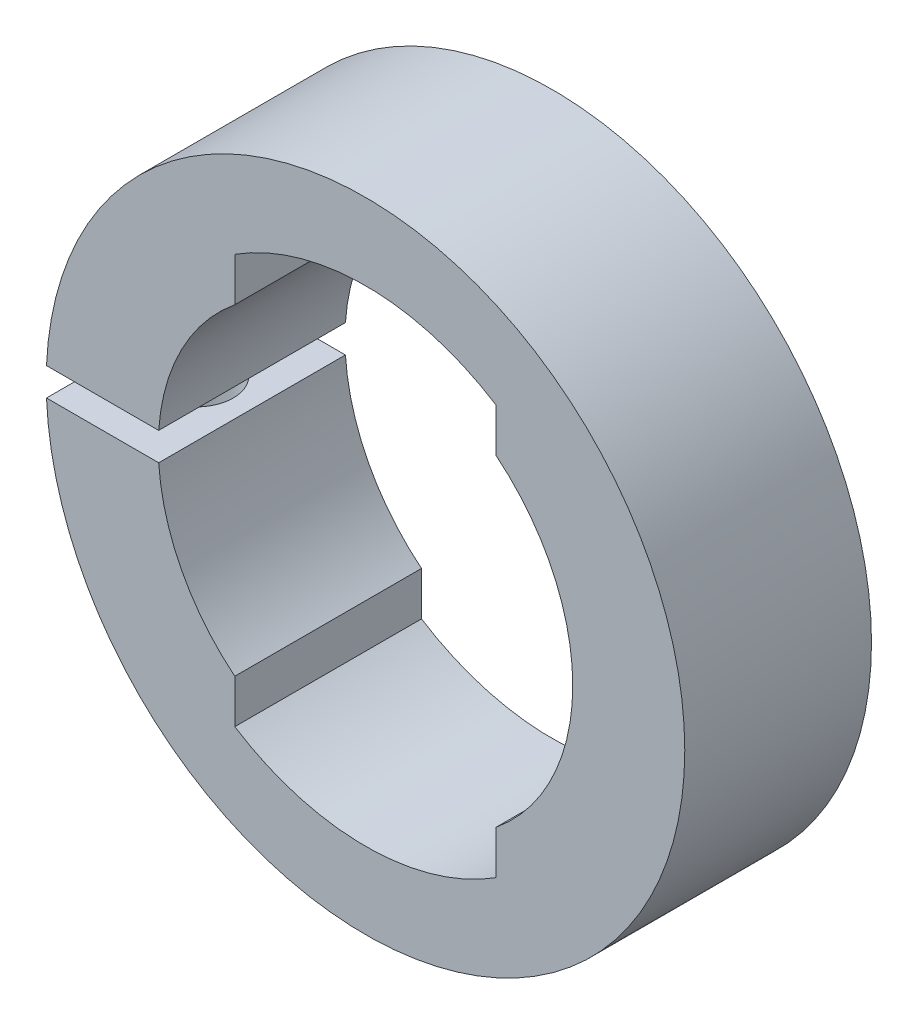
ISO-10303-21;
HEADER;
FILE_DESCRIPTION(('STEP AP214'),'2;1');
FILE_NAME('part.step','',(''),(''),'','','');
FILE_SCHEMA(('AUTOMOTIVE_DESIGN { 1 0 10303 214 1 1 1 1 }'));
ENDSEC;
DATA;
#1=APPLICATION_CONTEXT('core data for automotive mechanical design processes');
#2=APPLICATION_PROTOCOL_DEFINITION('international standard','automotive_design',2000,#1);
#3=PRODUCT_CONTEXT('',#1,'mechanical');
#4=PRODUCT('Part','Part','',(#3));
#5=PRODUCT_RELATED_PRODUCT_CATEGORY('part','',(#4));
#6=PRODUCT_DEFINITION_FORMATION('','',#4);
#7=PRODUCT_DEFINITION_CONTEXT('part definition',#1,'design');
#8=PRODUCT_DEFINITION('design','',#6,#7);
#9=PRODUCT_DEFINITION_SHAPE('','',#8);
#10=(LENGTH_UNIT() NAMED_UNIT(*) SI_UNIT(.MILLI.,.METRE.));
#11=(NAMED_UNIT(*) PLANE_ANGLE_UNIT() SI_UNIT($,.RADIAN.));
#12=(NAMED_UNIT(*) SI_UNIT($,.STERADIAN.) SOLID_ANGLE_UNIT());
#13=UNCERTAINTY_MEASURE_WITH_UNIT(LENGTH_MEASURE(1.E-05),#10,'distance_accuracy_value','');
#14=(GEOMETRIC_REPRESENTATION_CONTEXT(3) GLOBAL_UNCERTAINTY_ASSIGNED_CONTEXT((#13)) GLOBAL_UNIT_ASSIGNED_CONTEXT((#10,
#11,#12)) REPRESENTATION_CONTEXT('',''));
#15=CARTESIAN_POINT('',(0.,0.,0.));
#16=DIRECTION('',(0.,0.,1.));
#17=DIRECTION('',(1.,0.,0.));
#18=AXIS2_PLACEMENT_3D('',#15,#16,#17);
#19=CARTESIAN_POINT('',(0.,0.,10.));
#20=DIRECTION('',(0.,0.,-1.));
#21=DIRECTION('',(-1.,0.,0.));
#22=AXIS2_PLACEMENT_3D('',#19,#20,#21);
#23=CYLINDRICAL_SURFACE('',#22,17.1);
#24=CARTESIAN_POINT('',(-14.0790889454544,-9.70511486104027,7.));
#25=CARTESIAN_POINT('',(-13.9971796768476,-9.82394026483188,6.99999883556473));
#26=CARTESIAN_POINT('',(-13.9137614475811,-9.94172889745415,6.99498011342666));
#27=CARTESIAN_POINT('',(-13.7444167288773,-10.1745625090398,6.97364688944052));
#28=CARTESIAN_POINT('',(-13.6584893986911,-10.2896065443277,6.95732855873782));
#29=CARTESIAN_POINT('',(-13.4854094215952,-10.5154110552632,6.91193986279915));
#30=CARTESIAN_POINT('',(-13.3982642146928,-10.6261887774664,6.88292840828403));
#31=CARTESIAN_POINT('',(-13.2237605108071,-10.8425745688417,6.81034026178415));
#32=CARTESIAN_POINT('',(-13.1364024233375,-10.9481890031694,6.7667820496743));
#33=CARTESIAN_POINT('',(-12.9702260979268,-11.1444355072709,6.66705085713561));
#34=CARTESIAN_POINT('',(-12.891277951759,-11.2355921931944,6.61214457668782));
#35=CARTESIAN_POINT('',(-12.737225024283,-11.4099335295841,6.48636229639247));
#36=CARTESIAN_POINT('',(-12.6621178671249,-11.4931231365882,6.41549631871));
#37=CARTESIAN_POINT('',(-12.5304143908114,-11.6364375857535,6.26875875072897));
#38=CARTESIAN_POINT('',(-12.4727589363305,-11.6981355890741,6.19539674081035));
#39=CARTESIAN_POINT('',(-12.3655913816496,-11.8113593760879,6.03591340831983));
#40=CARTESIAN_POINT('',(-12.3160679633978,-11.8628993179954,5.94981014189123));
#41=CARTESIAN_POINT('',(-12.2377553138124,-11.943610740501,5.78485893977759));
#42=CARTESIAN_POINT('',(-12.2067959211163,-11.9752052795249,5.70823465069949));
#43=CARTESIAN_POINT('',(-12.1539991093591,-12.0287874192465,5.54869948830837));
#44=CARTESIAN_POINT('',(-12.1321564083992,-12.0507805829926,5.46579228809147));
#45=CARTESIAN_POINT('',(-12.0990864281154,-12.0839841926364,5.29524729423562));
#46=CARTESIAN_POINT('',(-12.0879196875681,-12.095133151841,5.20758546673287));
#47=CARTESIAN_POINT('',(-12.0773712302229,-12.1056667286171,5.03085451672658));
#48=CARTESIAN_POINT('',(-12.0779858095284,-12.105055043585,4.94178584531553));
#49=CARTESIAN_POINT('',(-12.0903253339946,-12.0927287390849,4.77356149962255));
#50=CARTESIAN_POINT('',(-12.1010201716515,-12.0820435169801,4.69424930003244));
#51=CARTESIAN_POINT('',(-12.131301925814,-12.0516376316376,4.53916326876548));
#52=CARTESIAN_POINT('',(-12.1508893804079,-12.0319164216357,4.46338965151274));
#53=CARTESIAN_POINT('',(-12.1985737279653,-11.9835712241014,4.31444052040912));
#54=CARTESIAN_POINT('',(-12.2269418016395,-11.9546625955259,4.24144583717547));
#55=CARTESIAN_POINT('',(-12.2903754948442,-11.8894384064285,4.10201133395357));
#56=CARTESIAN_POINT('',(-12.3254445250136,-11.8531190733802,4.03557487818724));
#57=CARTESIAN_POINT('',(-12.4193821667172,-11.7548083241557,3.87867887283195));
#58=CARTESIAN_POINT('',(-12.4814591808348,-11.6889891698847,3.79252824797331));
#59=CARTESIAN_POINT('',(-12.6129720683274,-11.5469640188204,3.63580755916028));
#60=CARTESIAN_POINT('',(-12.6824246520745,-11.4707343188216,3.5652740423959));
#61=CARTESIAN_POINT('',(-12.8574766354494,-11.2747191058618,3.41041413451061));
#62=CARTESIAN_POINT('',(-12.965343384269,-11.1507078754934,3.33404027974021));
#63=CARTESIAN_POINT('',(-13.1833865217762,-10.8920670152423,3.20733009112462));
#64=CARTESIAN_POINT('',(-13.2935663464883,-10.7574206262569,3.15703583689517));
#65=CARTESIAN_POINT('',(-13.4879208512188,-10.5121228601487,3.08724581593556));
#66=CARTESIAN_POINT('',(-13.5723732692809,-10.4028821945884,3.06336807514172));
#67=CARTESIAN_POINT('',(-13.7395097950387,-10.1811175012957,3.0271837447705));
#68=CARTESIAN_POINT('',(-13.8221929087563,-10.068591707796,3.01488350075308));
#69=CARTESIAN_POINT('',(-13.9852345170081,-9.84087790095273,3.00052440710828));
#70=CARTESIAN_POINT('',(-14.0655873060917,-9.72568442220669,2.99848887838968));
#71=CARTESIAN_POINT('',(-14.2233113437014,-9.49353026464363,3.00364768173807));
#72=CARTESIAN_POINT('',(-14.3006829438321,-9.37656979650632,3.01084092190085));
#73=CARTESIAN_POINT('',(-14.483238970838,-9.09311106904861,3.03828083938611));
#74=CARTESIAN_POINT('',(-14.5868157864033,-8.92596949228402,3.06267118651171));
#75=CARTESIAN_POINT('',(-14.7869877189588,-8.59029916551853,3.12652123874339));
#76=CARTESIAN_POINT('',(-14.8835780288377,-8.42176954762745,3.16599120435401));
#77=CARTESIAN_POINT('',(-15.0693477445868,-8.08466064368169,3.25925285645199));
#78=CARTESIAN_POINT('',(-15.1585307466875,-7.91608142207878,3.3130375392176));
#79=CARTESIAN_POINT('',(-15.2864651340432,-7.66438882615715,3.40470043406398));
#80=CARTESIAN_POINT('',(-15.3281250858271,-7.5807119781143,3.43707448129068));
#81=CARTESIAN_POINT('',(-15.4094576364799,-7.41398736507507,3.50569299307165));
#82=CARTESIAN_POINT('',(-15.4491305499784,-7.33093950226339,3.54193684201329));
#83=CARTESIAN_POINT('',(-15.525518870661,-7.16771897533482,3.61773049005809));
#84=CARTESIAN_POINT('',(-15.5622813664968,-7.08752415842705,3.65718484621809));
#85=CARTESIAN_POINT('',(-15.6337282672713,-6.92850177365312,3.74058950900743));
#86=CARTESIAN_POINT('',(-15.6684119690437,-6.84967467476166,3.78454132347405));
#87=CARTESIAN_POINT('',(-15.7354790197171,-6.6941663893559,3.87765062569799));
#88=CARTESIAN_POINT('',(-15.7678632625667,-6.61748437601236,3.92680607174842));
#89=CARTESIAN_POINT('',(-15.829977823054,-6.46748558065435,4.03145028458045));
#90=CARTESIAN_POINT('',(-15.8597109223282,-6.39416531163071,4.08693227070197));
#91=CARTESIAN_POINT('',(-15.9161531179751,-6.25235455787821,4.2065075341603));
#92=CARTESIAN_POINT('',(-15.9428339021456,-6.18391121593659,4.27067099617316));
#93=CARTESIAN_POINT('',(-15.9914255744994,-6.05712929671854,4.40978055031026));
#94=CARTESIAN_POINT('',(-16.0133670426977,-5.998726465989,4.48465199478544));
#95=CARTESIAN_POINT('',(-16.0397123773946,-5.92774970438711,4.6032859943466));
#96=CARTESIAN_POINT('',(-16.0471549333938,-5.90755210227411,4.64174728074971));
#97=CARTESIAN_POINT('',(-16.0600007149236,-5.87253941614575,4.72140527103462));
#98=CARTESIAN_POINT('',(-16.0654053578768,-5.85772059131699,4.76260005016102));
#99=CARTESIAN_POINT('',(-16.0737374368163,-5.8348197912533,4.84763270432824));
#100=CARTESIAN_POINT('',(-16.0766362739361,-5.82681560694595,4.89149513102099));
#101=CARTESIAN_POINT('',(-16.0794779374877,-5.81896984596838,4.98003234833601));
#102=CARTESIAN_POINT('',(-16.0794235990844,-5.81912044038902,5.02470631864521));
#103=CARTESIAN_POINT('',(-16.076551212674,-5.82704998256978,5.10812106751369));
#104=CARTESIAN_POINT('',(-16.074046918441,-5.8339629036355,5.14696071058787));
#105=CARTESIAN_POINT('',(-16.0669841961875,-5.85338576453118,5.22301253714336));
#106=CARTESIAN_POINT('',(-16.0624239005129,-5.86590079319367,5.26022320708712));
#107=CARTESIAN_POINT('',(-16.0487680423793,-5.90318640652301,5.35136952121897));
#108=CARTESIAN_POINT('',(-16.0385476421438,-5.9309443761195,5.40389984123299));
#109=CARTESIAN_POINT('',(-16.0152636927136,-5.99353376419013,5.50386674294489));
#110=CARTESIAN_POINT('',(-16.0021914683506,-6.02838674336141,5.55128710793769));
#111=CARTESIAN_POINT('',(-15.9745735500848,-6.10118462223026,5.639677469359));
#112=CARTESIAN_POINT('',(-15.9601125760682,-6.13893870782586,5.68083451519587));
#113=CARTESIAN_POINT('',(-15.9296978415582,-6.21743582347363,5.75962329031455));
#114=CARTESIAN_POINT('',(-15.9137426364351,-6.25818173764872,5.79725153612404));
#115=CARTESIAN_POINT('',(-15.8639973098181,-6.38370236682693,5.90580306814219));
#116=CARTESIAN_POINT('',(-15.8283804386871,-6.471619031163,5.97223540083192));
#117=CARTESIAN_POINT('',(-15.7468459864366,-6.6678402874853,6.10717252284563));
#118=CARTESIAN_POINT('',(-15.7002215462572,-6.77699676031431,6.17395800730474));
#119=CARTESIAN_POINT('',(-15.6026175922728,-6.99878858703495,6.29810703983429));
#120=CARTESIAN_POINT('',(-15.5516330000762,-7.11142789729828,6.35545936726858));
#121=CARTESIAN_POINT('',(-15.4456700380607,-7.33873488405986,6.46222911662369));
#122=CARTESIAN_POINT('',(-15.390686909686,-7.45340485029785,6.51163685181346));
#123=CARTESIAN_POINT('',(-15.2769802635406,-7.68377421850515,6.60324092335724));
#124=CARTESIAN_POINT('',(-15.2182560866286,-7.79947379877715,6.64543598404801));
#125=CARTESIAN_POINT('',(-15.0792919681743,-8.06558440637104,6.73443836013918));
#126=CARTESIAN_POINT('',(-14.9978260650265,-8.21613919392403,6.77891774347443));
#127=CARTESIAN_POINT('',(-14.8290425735892,-8.51699880315001,6.85639121088731));
#128=CARTESIAN_POINT('',(-14.7417227629746,-8.66730350743778,6.88938090334016));
#129=CARTESIAN_POINT('',(-14.5614769024935,-8.96682503387319,6.94323245446992));
#130=CARTESIAN_POINT('',(-14.4685486244848,-9.11604139690269,6.96408945757456));
#131=CARTESIAN_POINT('',(-14.2775301487095,-9.41239499654314,6.99247124021387));
#132=CARTESIAN_POINT('',(-14.1794420609943,-9.55953305230714,7.00000142663595));
#133=CARTESIAN_POINT('',(-14.0790889454544,-9.70511486104027,7.));
#134=B_SPLINE_CURVE_WITH_KNOTS('',3,(#24,#25,#26,#27,#28,#29,#30,#31,#32,#33,#34,#35,#36,#37,
#38,#39,#40,#41,#42,#43,#44,#45,#46,#47,#48,#49,#50,#51,#52,#53,#54,#55,#56,#57,#58,#59,#60,#61,
#62,#63,#64,#65,#66,#67,#68,#69,#70,#71,#72,#73,#74,#75,#76,#77,#78,#79,#80,#81,#82,#83,#84,#85,
#86,#87,#88,#89,#90,#91,#92,#93,#94,#95,#96,#97,#98,#99,#100,#101,#102,#103,#104,#105,#106,#107,
#108,#109,#110,#111,#112,#113,#114,#115,#116,#117,#118,#119,#120,#121,#122,#123,#124,#125,#126,
#127,#128,#129,#130,#131,#132,#133),.UNSPECIFIED.,.T.,.F.,(4,2,2,2,2,2,2,2,2,2,2,2,2,2,2,2,2,2,
2,2,2,2,2,2,2,2,2,2,2,2,2,2,2,2,2,2,2,2,2,2,2,2,2,2,2,2,2,2,2,2,2,2,2,2,4),(0.,
0.432845940862606,0.865838622710601,1.29684269064346,1.72730129038428,2.12379149962866,
2.52003341689974,2.85440155407282,3.18830030399107,3.45265953418252,3.71686539037358,
3.98256071061526,4.24817250100843,4.48928287821536,4.73040784685115,4.97988259756221,
5.22948466528432,5.60217060629126,5.97571969986485,6.51643254327666,7.05801513694439,
7.47784359716183,7.89790202920035,8.31891438392766,8.73987693106081,9.33348968409888,
9.92750706575199,10.521234346759,10.8179220428642,11.1145626116625,11.4043665485206,
11.6942679666299,11.9840560571156,12.2735364271393,12.5655150641642,12.8555493913362,
12.9874178695136,13.1191944597324,13.2524558823368,13.3855893709907,13.5036422912675,
13.62180266655,13.8016237840014,13.9819997352147,14.1548157024627,14.327800508632,
14.6744182551134,15.0824660216153,15.4909957001749,15.900019776853,16.3091161205267,
16.8392285656716,17.3695434102195,17.9000703440716,18.4303819858824),.UNSPECIFIED.);
#135=CARTESIAN_POINT('',(-14.0790889454544,-9.70511486104027,7.));
#136=VERTEX_POINT('',#135);
#137=EDGE_CURVE('E159',#136,#136,#134,.T.);
#138=ORIENTED_EDGE('',*,*,#137,.T.);
#139=EDGE_LOOP('',(#138));
#140=FACE_BOUND('',#139,.T.);
#141=CARTESIAN_POINT('',(-14.0790889454544,9.70511486104027,7.));
#142=CARTESIAN_POINT('',(-14.1750969398087,9.56584479310474,6.99999514601055));
#143=CARTESIAN_POINT('',(-14.2689725614211,9.42522607727704,6.99311072249329));
#144=CARTESIAN_POINT('',(-14.4520678300433,9.1419987772715,6.9670895008811));
#145=CARTESIAN_POINT('',(-14.5412853307401,8.99938931351317,6.94794710766036));
#146=CARTESIAN_POINT('',(-14.7148254682396,8.71275288164966,6.89842044794317));
#147=CARTESIAN_POINT('',(-14.7991371009962,8.56872351483555,6.86801195685157));
#148=CARTESIAN_POINT('',(-14.9624084573709,8.28032411378029,6.79657698673694));
#149=CARTESIAN_POINT('',(-15.0413699572524,8.13595420923524,6.75555405376));
#150=CARTESIAN_POINT('',(-15.1741361176407,7.884811882323,6.67488776022387));
#151=CARTESIAN_POINT('',(-15.2291834754735,7.77792966372406,6.6376086608443));
#152=CARTESIAN_POINT('',(-15.3361319815387,7.5648696577142,6.55702570668857));
#153=CARTESIAN_POINT('',(-15.3880335708742,7.45869177340887,6.51372269941033));
#154=CARTESIAN_POINT('',(-15.4883247810786,7.24812620994503,6.42081219797365));
#155=CARTESIAN_POINT('',(-15.5367294809116,7.14373253663555,6.37123466967484));
#156=CARTESIAN_POINT('',(-15.6300428545773,6.93718725680471,6.26473942925507));
#157=CARTESIAN_POINT('',(-15.6749538348839,6.83503420362214,6.20782662680358));
#158=CARTESIAN_POINT('',(-15.7468892474188,6.66715155619597,6.10498394425528));
#159=CARTESIAN_POINT('',(-15.7749804956226,6.6003811199835,6.06150198511602));
#160=CARTESIAN_POINT('',(-15.8292688914441,6.46910320884521,5.96940702028278));
#161=CARTESIAN_POINT('',(-15.8554570020086,6.4046071956686,5.92077192742697));
#162=CARTESIAN_POINT('',(-15.896228684815,6.30251878360692,5.83625631973209));
#163=CARTESIAN_POINT('',(-15.9115555765393,6.26370824742849,5.80221016181243));
#164=CARTESIAN_POINT('',(-15.9410361771549,6.18829554999257,5.73118679203207));
#165=CARTESIAN_POINT('',(-15.9551889540381,6.15169514928605,5.69420729639322));
#166=CARTESIAN_POINT('',(-15.9819344632628,6.08187129311069,5.61711675713959));
#167=CARTESIAN_POINT('',(-15.9945371462173,6.04862657369153,5.5770287093052));
#168=CARTESIAN_POINT('',(-16.0178522448844,5.98661025385087,5.49304312336789));
#169=CARTESIAN_POINT('',(-16.0285678280125,5.9578311679014,5.4491521567144));
#170=CARTESIAN_POINT('',(-16.0456650300573,5.91160910330398,5.36607570924884));
#171=CARTESIAN_POINT('',(-16.0524838747582,5.89305034821846,5.32761185587644));
#172=CARTESIAN_POINT('',(-16.0640381640664,5.86148120982493,5.2481586019005));
#173=CARTESIAN_POINT('',(-16.0687758792909,5.84846478003851,5.20717200969845));
#174=CARTESIAN_POINT('',(-16.0757581702141,5.82924607659105,5.12292591724103));
#175=CARTESIAN_POINT('',(-16.0779769423762,5.82311433515334,5.07964756390197));
#176=CARTESIAN_POINT('',(-16.0795477058043,5.81877591084882,4.99264017875867));
#177=CARTESIAN_POINT('',(-16.0789008079216,5.82056615709409,4.94891132814271));
#178=CARTESIAN_POINT('',(-16.0750473855035,5.83119839649581,4.86713641524113));
#179=CARTESIAN_POINT('',(-16.0721150369753,5.83928494971418,4.82897355872154));
#180=CARTESIAN_POINT('',(-16.0643049795501,5.86073678197708,4.75438559635317));
#181=CARTESIAN_POINT('',(-16.0594258879259,5.87410581297963,4.71796174631432));
#182=CARTESIAN_POINT('',(-16.0446322723096,5.91442847139961,4.6259142554357));
#183=CARTESIAN_POINT('',(-16.0334558067859,5.94471148612877,4.5719671433599));
#184=CARTESIAN_POINT('',(-16.0081815948153,6.01244004152356,4.46952237567659));
#185=CARTESIAN_POINT('',(-15.9940741423797,6.04990934713414,4.42104367331252));
#186=CARTESIAN_POINT('',(-15.9640517339444,6.12868626624631,4.32979802780224));
#187=CARTESIAN_POINT('',(-15.9481789041909,6.16990137599513,4.28693571236855));
#188=CARTESIAN_POINT('',(-15.9148386407894,6.25539994698034,4.20503141530018));
#189=CARTESIAN_POINT('',(-15.8973696074904,6.29968647532012,4.16599334916215));
#190=CARTESIAN_POINT('',(-15.8429491614058,6.43587451047884,4.05354444390956));
#191=CARTESIAN_POINT('',(-15.804039966798,6.53095724577667,3.98495588204095));
#192=CARTESIAN_POINT('',(-15.7150306249979,6.74264639408218,3.84604190701122));
#193=CARTESIAN_POINT('',(-15.6641668482581,6.86009223292105,3.77754188559433));
#194=CARTESIAN_POINT('',(-15.5576455648555,7.09836146774336,3.65066040242838));
#195=CARTESIAN_POINT('',(-15.5019825194978,7.21918865447031,3.59229087241268));
#196=CARTESIAN_POINT('',(-15.3862102569624,7.46275764247987,3.48418065709103));
#197=CARTESIAN_POINT('',(-15.3260951735572,7.58550179546325,3.43445165622753));
#198=CARTESIAN_POINT('',(-15.2016844120783,7.83184796310444,3.34297362441352));
#199=CARTESIAN_POINT('',(-15.1373881910115,7.95545008731536,3.3012256327202));
#200=CARTESIAN_POINT('',(-14.9954888774952,8.22015199184693,3.22017157809414));
#201=CARTESIAN_POINT('',(-14.9172817391617,8.36128355049293,3.18202175296923));
#202=CARTESIAN_POINT('',(-14.7557902257879,8.64309236194748,3.11593881626154));
#203=CARTESIAN_POINT('',(-14.6725043292435,8.78376946518672,3.08800878406101));
#204=CARTESIAN_POINT('',(-14.5012667664443,9.06366957346849,3.04306753126052));
#205=CARTESIAN_POINT('',(-14.4133246360489,9.20289490092424,3.02603486339785));
#206=CARTESIAN_POINT('',(-14.2330428936405,9.47933267835963,3.00386804966559));
#207=CARTESIAN_POINT('',(-14.1407052194849,9.61654598111003,2.99872870908469));
#208=CARTESIAN_POINT('',(-13.9205740976098,9.93358319298091,3.00231982675543));
#209=CARTESIAN_POINT('',(-13.7912245027596,10.1123596562869,3.01624637923339));
#210=CARTESIAN_POINT('',(-13.5938696989854,10.3744270755195,3.05859052520893));
#211=CARTESIAN_POINT('',(-13.5275278073136,10.4607689822744,3.07628174926161));
#212=CARTESIAN_POINT('',(-13.3942188873178,10.6309249970589,3.11961022174052));
#213=CARTESIAN_POINT('',(-13.3272520414103,10.7147398142503,3.14524521774741));
#214=CARTESIAN_POINT('',(-13.1610793702554,10.9188188390713,3.21980304529065));
#215=CARTESIAN_POINT('',(-13.0618601718521,11.0372236419412,3.27399638486826));
#216=CARTESIAN_POINT('',(-12.8668148844148,11.2639828328955,3.40496202814771));
#217=CARTESIAN_POINT('',(-12.7709831909343,11.3723543528519,3.48169487415753));
#218=CARTESIAN_POINT('',(-12.6152946504007,11.5444183096905,3.63420687225286));
#219=CARTESIAN_POINT('',(-12.553208800965,11.6118189198622,3.70349582643836));
#220=CARTESIAN_POINT('',(-12.4361529961771,11.737095339086,3.85547884830442));
#221=CARTESIAN_POINT('',(-12.3811734973794,11.7949839512023,3.93815459470884));
#222=CARTESIAN_POINT('',(-12.2915314053133,11.8882973745392,4.09922577640623));
#223=CARTESIAN_POINT('',(-12.2549978603872,11.9259013849349,4.17530598835095));
#224=CARTESIAN_POINT('',(-12.1908890511253,11.9914273351586,4.33509819404268));
#225=CARTESIAN_POINT('',(-12.1633094112072,12.0193540045476,4.4188064344439));
#226=CARTESIAN_POINT('',(-12.1189480238974,12.0640837520647,4.59263860416495));
#227=CARTESIAN_POINT('',(-12.1022464121353,12.0808043031559,4.68280483359311));
#228=CARTESIAN_POINT('',(-12.0814593385738,12.1015937612148,4.86600648160251));
#229=CARTESIAN_POINT('',(-12.0773658768035,12.1056706906718,4.9590400429692));
#230=CARTESIAN_POINT('',(-12.0818598432552,12.1011840641145,5.13316825407775));
#231=CARTESIAN_POINT('',(-12.0889742086535,12.0940889283628,5.21434666605232));
#232=CARTESIAN_POINT('',(-12.1126860606118,12.0703403064187,5.37384404276157));
#233=CARTESIAN_POINT('',(-12.1292833307748,12.0536870383399,5.45216307270311));
#234=CARTESIAN_POINT('',(-12.1709465265713,12.0116163836977,5.60435816341204));
#235=CARTESIAN_POINT('',(-12.1960461433681,11.9861641221093,5.67821514926141));
#236=CARTESIAN_POINT('',(-12.2532741615963,11.9276548248952,5.81990881654717));
#237=CARTESIAN_POINT('',(-12.2854056881146,11.8945944077525,5.88774280236984));
#238=CARTESIAN_POINT('',(-12.3708455769681,11.8058222539988,6.04553833948983));
#239=CARTESIAN_POINT('',(-12.427206475532,11.7465850586769,6.13187112226343));
#240=CARTESIAN_POINT('',(-12.5476872292136,11.6178041832184,6.29025645018913));
#241=CARTESIAN_POINT('',(-12.6118236687877,11.548238399675,6.36227757549818));
#242=CARTESIAN_POINT('',(-12.7731262069158,11.3700081801055,6.5205665169531));
#243=CARTESIAN_POINT('',(-12.8727115311455,11.2573236123193,6.59980677935944));
#244=CARTESIAN_POINT('',(-13.0753431371105,11.0213311812175,6.73416314640427));
#245=CARTESIAN_POINT('',(-13.178394951829,10.8980057899722,6.78923850158553));
#246=CARTESIAN_POINT('',(-13.3494594378888,10.6870802667532,6.86363738742375));
#247=CARTESIAN_POINT('',(-13.4175435580632,10.6014924357377,6.88875306007361));
#248=CARTESIAN_POINT('',(-13.5529942772266,10.4277749999603,6.9308687926636));
#249=CARTESIAN_POINT('',(-13.6203606749115,10.339644706527,6.94786663143583));
#250=CARTESIAN_POINT('',(-13.8206373445672,10.0722117246681,6.98790847006165));
#251=CARTESIAN_POINT('',(-13.9517390696337,9.88984974667569,7.00000643857793));
#252=CARTESIAN_POINT('',(-14.0790889454544,9.70511486104027,7.));
#253=B_SPLINE_CURVE_WITH_KNOTS('',3,(#141,#142,#143,#144,#145,#146,#147,#148,#149,#150,#151,
#152,#153,#154,#155,#156,#157,#158,#159,#160,#161,#162,#163,#164,#165,#166,#167,#168,#169,#170,
#171,#172,#173,#174,#175,#176,#177,#178,#179,#180,#181,#182,#183,#184,#185,#186,#187,#188,#189,
#190,#191,#192,#193,#194,#195,#196,#197,#198,#199,#200,#201,#202,#203,#204,#205,#206,#207,#208,
#209,#210,#211,#212,#213,#214,#215,#216,#217,#218,#219,#220,#221,#222,#223,#224,#225,#226,#227,
#228,#229,#230,#231,#232,#233,#234,#235,#236,#237,#238,#239,#240,#241,#242,#243,#244,#245,#246,
#247,#248,#249,#250,#251,#252),.UNSPECIFIED.,.T.,.F.,(4,2,2,2,2,2,2,2,2,2,2,2,2,2,2,2,2,2,2,2,2,
2,2,2,2,2,2,2,2,2,2,2,2,2,2,2,2,2,2,2,2,2,2,2,2,2,2,2,2,2,2,2,2,2,2,4),(0.,0.507173258851666,
1.01457818109791,1.5230805284446,2.03141321545233,2.40886505796862,2.78626385074701,
3.16192385434638,3.53733371318976,3.79064944810504,4.04509858299481,4.2065579337397,
4.36814424783159,4.52863216080284,4.68884807973209,4.8182093130045,4.94742905394235,
5.07796087825129,5.20844210749564,5.32530592833931,5.44225290307802,5.62976599486455,
5.81791022844438,6.00226516865486,6.18680693188068,6.55655122580463,6.9914773241764,
7.42691225430054,7.86293150892887,8.2990075017385,8.79601390703758,9.29316994500086,
9.78934448826021,10.2853022738101,10.9466306503388,11.2773132045897,11.6079020810131,
12.0975048178838,12.5862555122634,12.9297934042411,13.2728650408696,13.5489624427809,
13.8249247179794,14.1028976074401,14.380694084532,14.6249102763572,14.8691208954649,
15.1143107622578,15.359609817211,15.7143403512283,16.0698412603568,16.5769856250924,
17.0849819346498,17.4212941252762,17.757698283598,18.430438631615),.UNSPECIFIED.);
#254=CARTESIAN_POINT('',(-14.0790889454544,9.70511486104027,7.));
#255=VERTEX_POINT('',#254);
#256=EDGE_CURVE('E270',#255,#255,#253,.T.);
#257=ORIENTED_EDGE('',*,*,#256,.T.);
#258=EDGE_LOOP('',(#257));
#259=FACE_BOUND('',#258,.T.);
#260=CARTESIAN_POINT('',(0.,0.,0.));
#261=DIRECTION('',(0.,0.,1.));
#262=DIRECTION('',(1.,0.,0.));
#263=AXIS2_PLACEMENT_3D('',#260,#261,#262);
#264=CIRCLE('',#263,17.1);
#265=CARTESIAN_POINT('',(-17.0835447141394,-0.749999999999959,0.));
#266=VERTEX_POINT('',#265);
#267=CARTESIAN_POINT('',(-17.0835447141394,0.750000000000041,0.));
#268=VERTEX_POINT('',#267);
#269=EDGE_CURVE('E155',#266,#268,#264,.T.);
#270=ORIENTED_EDGE('',*,*,#269,.T.);
#271=DIRECTION('',(0.,0.,-1.));
#272=VECTOR('',#271,1.);
#273=CARTESIAN_POINT('',(-17.0835447141394,0.750000000000041,10.));
#274=LINE('',#273,#272);
#275=CARTESIAN_POINT('',(-17.0835447141394,0.750000000000041,10.));
#276=VERTEX_POINT('',#275);
#277=EDGE_CURVE('E11',#276,#268,#274,.T.);
#278=ORIENTED_EDGE('',*,*,#277,.F.);
#279=CARTESIAN_POINT('',(0.,0.,10.));
#280=DIRECTION('',(0.,0.,1.));
#281=DIRECTION('',(1.,0.,0.));
#282=AXIS2_PLACEMENT_3D('',#279,#280,#281);
#283=CIRCLE('',#282,17.1);
#284=CARTESIAN_POINT('',(-17.0835447141394,-0.749999999999959,10.));
#285=VERTEX_POINT('',#284);
#286=EDGE_CURVE('E178',#285,#276,#283,.T.);
#287=ORIENTED_EDGE('',*,*,#286,.F.);
#288=DIRECTION('',(0.,0.,-1.));
#289=VECTOR('',#288,1.);
#290=CARTESIAN_POINT('',(-17.0835447141394,-0.749999999999959,10.));
#291=LINE('',#290,#289);
#292=EDGE_CURVE('E151',#285,#266,#291,.T.);
#293=ORIENTED_EDGE('',*,*,#292,.T.);
#294=EDGE_LOOP('',(#270,#278,#287,#293));
#295=FACE_BOUND('',#294,.T.);
#296=ADVANCED_FACE('F33',(#140,#259,#295),#23,.T.);
#297=CARTESIAN_POINT('',(-17.0835447141394,0.750000000000041,10.));
#298=DIRECTION('',(0.,1.,0.));
#299=DIRECTION('',(-1.,0.,0.));
#300=AXIS2_PLACEMENT_3D('',#297,#298,#299);
#301=PLANE('',#300);
#302=CARTESIAN_POINT('',(-14.0790889454544,0.749999999999997,5.));
#303=DIRECTION('',(0.,1.,0.));
#304=DIRECTION('',(-1.,0.,0.));
#305=AXIS2_PLACEMENT_3D('',#302,#303,#304);
#306=CIRCLE('',#305,2.);
#307=CARTESIAN_POINT('',(-16.0790889454544,0.750000000000026,5.));
#308=VERTEX_POINT('',#307);
#309=EDGE_CURVE('E272',#308,#308,#306,.T.);
#310=ORIENTED_EDGE('',*,*,#309,.T.);
#311=EDGE_LOOP('',(#310));
#312=FACE_BOUND('',#311,.T.);
#313=DIRECTION('',(1.,0.,0.));
#314=VECTOR('',#313,1.);
#315=CARTESIAN_POINT('',(-17.0835447141394,0.750000000000041,0.));
#316=LINE('',#315,#314);
#317=CARTESIAN_POINT('',(-11.0746331767693,0.749999999999953,0.));
#318=VERTEX_POINT('',#317);
#319=EDGE_CURVE('E158',#268,#318,#316,.T.);
#320=ORIENTED_EDGE('',*,*,#319,.T.);
#321=DIRECTION('',(0.,0.,-1.));
#322=VECTOR('',#321,1.);
#323=CARTESIAN_POINT('',(-11.0746331767693,0.749999999999953,10.));
#324=LINE('',#323,#322);
#325=CARTESIAN_POINT('',(-11.0746331767693,0.749999999999953,10.));
#326=VERTEX_POINT('',#325);
#327=EDGE_CURVE('E43',#326,#318,#324,.T.);
#328=ORIENTED_EDGE('',*,*,#327,.F.);
#329=DIRECTION('',(1.,0.,0.));
#330=VECTOR('',#329,1.);
#331=CARTESIAN_POINT('',(-17.0835447141394,0.750000000000041,10.));
#332=LINE('',#331,#330);
#333=EDGE_CURVE('E106',#276,#326,#332,.T.);
#334=ORIENTED_EDGE('',*,*,#333,.F.);
#335=ORIENTED_EDGE('',*,*,#277,.T.);
#336=EDGE_LOOP('',(#320,#328,#334,#335));
#337=FACE_BOUND('',#336,.T.);
#338=ADVANCED_FACE('F259',(#312,#337),#301,.F.);
#339=CARTESIAN_POINT('',(0.,0.,10.));
#340=DIRECTION('',(0.,0.,-1.));
#341=DIRECTION('',(-1.,0.,0.));
#342=AXIS2_PLACEMENT_3D('',#339,#340,#341);
#343=CYLINDRICAL_SURFACE('',#342,11.1);
#344=CARTESIAN_POINT('',(0.,0.,0.));
#345=DIRECTION('',(0.,0.,-1.));
#346=DIRECTION('',(1.,0.,0.));
#347=AXIS2_PLACEMENT_3D('',#344,#345,#346);
#348=CIRCLE('',#347,11.1);
#349=CARTESIAN_POINT('',(-7.,8.61452262171271,0.));
#350=VERTEX_POINT('',#349);
#351=EDGE_CURVE('E161',#318,#350,#348,.T.);
#352=ORIENTED_EDGE('',*,*,#351,.T.);
#353=DIRECTION('',(0.,0.,-1.));
#354=VECTOR('',#353,1.);
#355=CARTESIAN_POINT('',(-7.,8.61452262171271,10.));
#356=LINE('',#355,#354);
#357=CARTESIAN_POINT('',(-7.,8.61452262171271,10.));
#358=VERTEX_POINT('',#357);
#359=EDGE_CURVE('E197',#358,#350,#356,.T.);
#360=ORIENTED_EDGE('',*,*,#359,.F.);
#361=CARTESIAN_POINT('',(0.,0.,10.));
#362=DIRECTION('',(0.,0.,-1.));
#363=DIRECTION('',(1.,0.,0.));
#364=AXIS2_PLACEMENT_3D('',#361,#362,#363);
#365=CIRCLE('',#364,11.1);
#366=EDGE_CURVE('E206',#326,#358,#365,.T.);
#367=ORIENTED_EDGE('',*,*,#366,.F.);
#368=ORIENTED_EDGE('',*,*,#327,.T.);
#369=EDGE_LOOP('',(#352,#360,#367,#368));
#370=FACE_BOUND('',#369,.T.);
#371=ADVANCED_FACE('F204',(#370),#343,.F.);
#372=CARTESIAN_POINT('',(-7.,10.9544511501033,10.));
#373=DIRECTION('',(-1.,0.,0.));
#374=DIRECTION('',(0.,0.,1.));
#375=AXIS2_PLACEMENT_3D('',#372,#373,#374);
#376=PLANE('',#375);
#377=DIRECTION('',(0.,1.,0.));
#378=VECTOR('',#377,1.);
#379=CARTESIAN_POINT('',(-7.,10.9544511501033,0.));
#380=LINE('',#379,#378);
#381=CARTESIAN_POINT('',(-7.,10.9544511501033,0.));
#382=VERTEX_POINT('',#381);
#383=EDGE_CURVE('E163',#350,#382,#380,.T.);
#384=ORIENTED_EDGE('',*,*,#383,.T.);
#385=DIRECTION('',(0.,0.,-1.));
#386=VECTOR('',#385,1.);
#387=CARTESIAN_POINT('',(-7.,10.9544511501033,10.));
#388=LINE('',#387,#386);
#389=CARTESIAN_POINT('',(-7.,10.9544511501033,10.));
#390=VERTEX_POINT('',#389);
#391=EDGE_CURVE('E194',#390,#382,#388,.T.);
#392=ORIENTED_EDGE('',*,*,#391,.F.);
#393=DIRECTION('',(0.,1.,0.));
#394=VECTOR('',#393,1.);
#395=CARTESIAN_POINT('',(-7.,10.9544511501033,10.));
#396=LINE('',#395,#394);
#397=EDGE_CURVE('E224',#358,#390,#396,.T.);
#398=ORIENTED_EDGE('',*,*,#397,.F.);
#399=ORIENTED_EDGE('',*,*,#359,.T.);
#400=EDGE_LOOP('',(#384,#392,#398,#399));
#401=FACE_BOUND('',#400,.T.);
#402=ADVANCED_FACE('F215',(#401),#376,.F.);
#403=CARTESIAN_POINT('',(0.,0.,10.));
#404=DIRECTION('',(0.,0.,-1.));
#405=DIRECTION('',(-1.,0.,0.));
#406=AXIS2_PLACEMENT_3D('',#403,#404,#405);
#407=CYLINDRICAL_SURFACE('',#406,13.);
#408=CARTESIAN_POINT('',(0.,0.,0.));
#409=DIRECTION('',(0.,0.,-1.));
#410=DIRECTION('',(1.,0.,0.));
#411=AXIS2_PLACEMENT_3D('',#408,#409,#410);
#412=CIRCLE('',#411,13.);
#413=CARTESIAN_POINT('',(7.,10.9544511501033,0.));
#414=VERTEX_POINT('',#413);
#415=EDGE_CURVE('E165',#382,#414,#412,.T.);
#416=ORIENTED_EDGE('',*,*,#415,.T.);
#417=DIRECTION('',(0.,0.,-1.));
#418=VECTOR('',#417,1.);
#419=CARTESIAN_POINT('',(7.,10.9544511501033,10.));
#420=LINE('',#419,#418);
#421=CARTESIAN_POINT('',(7.,10.9544511501033,10.));
#422=VERTEX_POINT('',#421);
#423=EDGE_CURVE('E191',#422,#414,#420,.T.);
#424=ORIENTED_EDGE('',*,*,#423,.F.);
#425=CARTESIAN_POINT('',(0.,0.,10.));
#426=DIRECTION('',(0.,0.,-1.));
#427=DIRECTION('',(1.,0.,0.));
#428=AXIS2_PLACEMENT_3D('',#425,#426,#427);
#429=CIRCLE('',#428,13.);
#430=EDGE_CURVE('E221',#390,#422,#429,.T.);
#431=ORIENTED_EDGE('',*,*,#430,.F.);
#432=ORIENTED_EDGE('',*,*,#391,.T.);
#433=EDGE_LOOP('',(#416,#424,#431,#432));
#434=FACE_BOUND('',#433,.T.);
#435=ADVANCED_FACE('F219',(#434),#407,.F.);
#436=CARTESIAN_POINT('',(7.,10.9544511501033,10.));
#437=DIRECTION('',(1.,0.,0.));
#438=DIRECTION('',(0.,0.,-1.));
#439=AXIS2_PLACEMENT_3D('',#436,#437,#438);
#440=PLANE('',#439);
#441=DIRECTION('',(0.,-1.,0.));
#442=VECTOR('',#441,1.);
#443=CARTESIAN_POINT('',(7.,10.9544511501033,0.));
#444=LINE('',#443,#442);
#445=CARTESIAN_POINT('',(7.,8.61452262171271,0.));
#446=VERTEX_POINT('',#445);
#447=EDGE_CURVE('E167',#414,#446,#444,.T.);
#448=ORIENTED_EDGE('',*,*,#447,.T.);
#449=DIRECTION('',(0.,0.,-1.));
#450=VECTOR('',#449,1.);
#451=CARTESIAN_POINT('',(7.,8.61452262171271,10.));
#452=LINE('',#451,#450);
#453=CARTESIAN_POINT('',(7.,8.61452262171271,10.));
#454=VERTEX_POINT('',#453);
#455=EDGE_CURVE('E188',#454,#446,#452,.T.);
#456=ORIENTED_EDGE('',*,*,#455,.F.);
#457=DIRECTION('',(0.,-1.,0.));
#458=VECTOR('',#457,1.);
#459=CARTESIAN_POINT('',(7.,10.9544511501033,10.));
#460=LINE('',#459,#458);
#461=EDGE_CURVE('E223',#422,#454,#460,.T.);
#462=ORIENTED_EDGE('',*,*,#461,.F.);
#463=ORIENTED_EDGE('',*,*,#423,.T.);
#464=EDGE_LOOP('',(#448,#456,#462,#463));
#465=FACE_BOUND('',#464,.T.);
#466=ADVANCED_FACE('F361',(#465),#440,.F.);
#467=CARTESIAN_POINT('',(0.,0.,10.));
#468=DIRECTION('',(0.,0.,-1.));
#469=DIRECTION('',(-1.,0.,0.));
#470=AXIS2_PLACEMENT_3D('',#467,#468,#469);
#471=CYLINDRICAL_SURFACE('',#470,11.1);
#472=CARTESIAN_POINT('',(0.,0.,0.));
#473=DIRECTION('',(0.,0.,-1.));
#474=DIRECTION('',(1.,0.,0.));
#475=AXIS2_PLACEMENT_3D('',#472,#473,#474);
#476=CIRCLE('',#475,11.1);
#477=CARTESIAN_POINT('',(7.,-8.61452262171271,0.));
#478=VERTEX_POINT('',#477);
#479=EDGE_CURVE('E169',#446,#478,#476,.T.);
#480=ORIENTED_EDGE('',*,*,#479,.T.);
#481=DIRECTION('',(0.,0.,-1.));
#482=VECTOR('',#481,1.);
#483=CARTESIAN_POINT('',(7.,-8.61452262171271,10.));
#484=LINE('',#483,#482);
#485=CARTESIAN_POINT('',(7.,-8.61452262171271,10.));
#486=VERTEX_POINT('',#485);
#487=EDGE_CURVE('E185',#486,#478,#484,.T.);
#488=ORIENTED_EDGE('',*,*,#487,.F.);
#489=CARTESIAN_POINT('',(0.,0.,10.));
#490=DIRECTION('',(0.,0.,-1.));
#491=DIRECTION('',(1.,0.,0.));
#492=AXIS2_PLACEMENT_3D('',#489,#490,#491);
#493=CIRCLE('',#492,11.1);
#494=EDGE_CURVE('E226',#454,#486,#493,.T.);
#495=ORIENTED_EDGE('',*,*,#494,.F.);
#496=ORIENTED_EDGE('',*,*,#455,.T.);
#497=EDGE_LOOP('',(#480,#488,#495,#496));
#498=FACE_BOUND('',#497,.T.);
#499=ADVANCED_FACE('F352',(#498),#471,.F.);
#500=CARTESIAN_POINT('',(7.,-8.61452262171271,10.));
#501=DIRECTION('',(1.,0.,0.));
#502=DIRECTION('',(0.,0.,-1.));
#503=AXIS2_PLACEMENT_3D('',#500,#501,#502);
#504=PLANE('',#503);
#505=DIRECTION('',(0.,-1.,0.));
#506=VECTOR('',#505,1.);
#507=CARTESIAN_POINT('',(7.,-8.61452262171271,0.));
#508=LINE('',#507,#506);
#509=CARTESIAN_POINT('',(7.,-10.9544511501033,0.));
#510=VERTEX_POINT('',#509);
#511=EDGE_CURVE('E171',#478,#510,#508,.T.);
#512=ORIENTED_EDGE('',*,*,#511,.T.);
#513=DIRECTION('',(0.,0.,-1.));
#514=VECTOR('',#513,1.);
#515=CARTESIAN_POINT('',(7.,-10.9544511501033,10.));
#516=LINE('',#515,#514);
#517=CARTESIAN_POINT('',(7.,-10.9544511501033,10.));
#518=VERTEX_POINT('',#517);
#519=EDGE_CURVE('E182',#518,#510,#516,.T.);
#520=ORIENTED_EDGE('',*,*,#519,.F.);
#521=DIRECTION('',(0.,-1.,0.));
#522=VECTOR('',#521,1.);
#523=CARTESIAN_POINT('',(7.,-8.61452262171271,10.));
#524=LINE('',#523,#522);
#525=EDGE_CURVE('E232',#486,#518,#524,.T.);
#526=ORIENTED_EDGE('',*,*,#525,.F.);
#527=ORIENTED_EDGE('',*,*,#487,.T.);
#528=EDGE_LOOP('',(#512,#520,#526,#527));
#529=FACE_BOUND('',#528,.T.);
#530=ADVANCED_FACE('F238',(#529),#504,.F.);
#531=CARTESIAN_POINT('',(0.,0.,10.));
#532=DIRECTION('',(0.,0.,-1.));
#533=DIRECTION('',(-1.,0.,0.));
#534=AXIS2_PLACEMENT_3D('',#531,#532,#533);
#535=CYLINDRICAL_SURFACE('',#534,13.);
#536=CARTESIAN_POINT('',(0.,0.,0.));
#537=DIRECTION('',(0.,0.,-1.));
#538=DIRECTION('',(1.,0.,0.));
#539=AXIS2_PLACEMENT_3D('',#536,#537,#538);
#540=CIRCLE('',#539,13.);
#541=CARTESIAN_POINT('',(-7.00000000000001,-10.9544511501033,0.));
#542=VERTEX_POINT('',#541);
#543=EDGE_CURVE('E173',#510,#542,#540,.T.);
#544=ORIENTED_EDGE('',*,*,#543,.T.);
#545=DIRECTION('',(0.,0.,-1.));
#546=VECTOR('',#545,1.);
#547=CARTESIAN_POINT('',(-7.00000000000001,-10.9544511501033,10.));
#548=LINE('',#547,#546);
#549=CARTESIAN_POINT('',(-7.00000000000001,-10.9544511501033,10.));
#550=VERTEX_POINT('',#549);
#551=EDGE_CURVE('E146',#550,#542,#548,.T.);
#552=ORIENTED_EDGE('',*,*,#551,.F.);
#553=CARTESIAN_POINT('',(0.,0.,10.));
#554=DIRECTION('',(0.,0.,-1.));
#555=DIRECTION('',(1.,0.,0.));
#556=AXIS2_PLACEMENT_3D('',#553,#554,#555);
#557=CIRCLE('',#556,13.);
#558=EDGE_CURVE('E137',#518,#550,#557,.T.);
#559=ORIENTED_EDGE('',*,*,#558,.F.);
#560=ORIENTED_EDGE('',*,*,#519,.T.);
#561=EDGE_LOOP('',(#544,#552,#559,#560));
#562=FACE_BOUND('',#561,.T.);
#563=ADVANCED_FACE('F242',(#562),#535,.F.);
#564=CARTESIAN_POINT('',(-7.,-8.61452262171271,10.));
#565=DIRECTION('',(-1.,0.,0.));
#566=DIRECTION('',(0.,0.,1.));
#567=AXIS2_PLACEMENT_3D('',#564,#565,#566);
#568=PLANE('',#567);
#569=DIRECTION('',(0.,1.,0.));
#570=VECTOR('',#569,1.);
#571=CARTESIAN_POINT('',(-7.,-8.61452262171271,0.));
#572=LINE('',#571,#570);
#573=CARTESIAN_POINT('',(-7.,-8.61452262171271,0.));
#574=VERTEX_POINT('',#573);
#575=EDGE_CURVE('E145',#542,#574,#572,.T.);
#576=ORIENTED_EDGE('',*,*,#575,.T.);
#577=DIRECTION('',(0.,0.,-1.));
#578=VECTOR('',#577,1.);
#579=CARTESIAN_POINT('',(-7.,-8.61452262171271,10.));
#580=LINE('',#579,#578);
#581=CARTESIAN_POINT('',(-7.,-8.61452262171271,10.));
#582=VERTEX_POINT('',#581);
#583=EDGE_CURVE('E142',#582,#574,#580,.T.);
#584=ORIENTED_EDGE('',*,*,#583,.F.);
#585=DIRECTION('',(0.,1.,0.));
#586=VECTOR('',#585,1.);
#587=CARTESIAN_POINT('',(-7.,-8.61452262171271,10.));
#588=LINE('',#587,#586);
#589=EDGE_CURVE('E131',#550,#582,#588,.T.);
#590=ORIENTED_EDGE('',*,*,#589,.F.);
#591=ORIENTED_EDGE('',*,*,#551,.T.);
#592=EDGE_LOOP('',(#576,#584,#590,#591));
#593=FACE_BOUND('',#592,.T.);
#594=ADVANCED_FACE('F143',(#593),#568,.F.);
#595=CARTESIAN_POINT('',(0.,0.,10.));
#596=DIRECTION('',(0.,0.,-1.));
#597=DIRECTION('',(-1.,0.,0.));
#598=AXIS2_PLACEMENT_3D('',#595,#596,#597);
#599=CYLINDRICAL_SURFACE('',#598,11.1);
#600=CARTESIAN_POINT('',(0.,0.,0.));
#601=DIRECTION('',(0.,0.,-1.));
#602=DIRECTION('',(1.,0.,0.));
#603=AXIS2_PLACEMENT_3D('',#600,#601,#602);
#604=CIRCLE('',#603,11.1);
#605=CARTESIAN_POINT('',(-11.0746331767693,-0.750000000000042,0.));
#606=VERTEX_POINT('',#605);
#607=EDGE_CURVE('E92',#574,#606,#604,.T.);
#608=ORIENTED_EDGE('',*,*,#607,.T.);
#609=DIRECTION('',(0.,0.,-1.));
#610=VECTOR('',#609,1.);
#611=CARTESIAN_POINT('',(-11.0746331767693,-0.750000000000042,10.));
#612=LINE('',#611,#610);
#613=CARTESIAN_POINT('',(-11.0746331767693,-0.750000000000042,10.));
#614=VERTEX_POINT('',#613);
#615=EDGE_CURVE('E147',#614,#606,#612,.T.);
#616=ORIENTED_EDGE('',*,*,#615,.F.);
#617=CARTESIAN_POINT('',(0.,0.,10.));
#618=DIRECTION('',(0.,0.,-1.));
#619=DIRECTION('',(1.,0.,0.));
#620=AXIS2_PLACEMENT_3D('',#617,#618,#619);
#621=CIRCLE('',#620,11.1);
#622=EDGE_CURVE('E135',#582,#614,#621,.T.);
#623=ORIENTED_EDGE('',*,*,#622,.F.);
#624=ORIENTED_EDGE('',*,*,#583,.T.);
#625=EDGE_LOOP('',(#608,#616,#623,#624));
#626=FACE_BOUND('',#625,.T.);
#627=ADVANCED_FACE('F149',(#626),#599,.F.);
#628=CARTESIAN_POINT('',(-17.0835447141394,-0.749999999999959,10.));
#629=DIRECTION('',(0.,-1.,0.));
#630=DIRECTION('',(1.,0.,0.));
#631=AXIS2_PLACEMENT_3D('',#628,#629,#630);
#632=PLANE('',#631);
#633=CARTESIAN_POINT('',(-14.0790889454544,-0.750000000000004,5.));
#634=DIRECTION('',(0.,-1.,0.));
#635=DIRECTION('',(1.,0.,0.));
#636=AXIS2_PLACEMENT_3D('',#633,#634,#635);
#637=CIRCLE('',#636,2.);
#638=CARTESIAN_POINT('',(-12.0790889454544,-0.750000000000033,5.));
#639=VERTEX_POINT('',#638);
#640=EDGE_CURVE('E37',#639,#639,#637,.T.);
#641=ORIENTED_EDGE('',*,*,#640,.T.);
#642=EDGE_LOOP('',(#641));
#643=FACE_BOUND('',#642,.T.);
#644=DIRECTION('',(-1.,0.,0.));
#645=VECTOR('',#644,1.);
#646=CARTESIAN_POINT('',(-17.0835447141394,-0.749999999999959,0.));
#647=LINE('',#646,#645);
#648=EDGE_CURVE('E98',#606,#266,#647,.T.);
#649=ORIENTED_EDGE('',*,*,#648,.T.);
#650=ORIENTED_EDGE('',*,*,#292,.F.);
#651=DIRECTION('',(-1.,0.,0.));
#652=VECTOR('',#651,1.);
#653=CARTESIAN_POINT('',(-17.0835447141394,-0.749999999999959,10.));
#654=LINE('',#653,#652);
#655=EDGE_CURVE('E51',#614,#285,#654,.T.);
#656=ORIENTED_EDGE('',*,*,#655,.F.);
#657=ORIENTED_EDGE('',*,*,#615,.T.);
#658=EDGE_LOOP('',(#649,#650,#656,#657));
#659=FACE_BOUND('',#658,.T.);
#660=ADVANCED_FACE('F246',(#643,#659),#632,.F.);
#661=CARTESIAN_POINT('',(0.,0.,10.));
#662=DIRECTION('',(0.,0.,1.));
#663=DIRECTION('',(1.,0.,0.));
#664=AXIS2_PLACEMENT_3D('',#661,#662,#663);
#665=PLANE('',#664);
#666=ORIENTED_EDGE('',*,*,#286,.T.);
#667=ORIENTED_EDGE('',*,*,#333,.T.);
#668=ORIENTED_EDGE('',*,*,#366,.T.);
#669=ORIENTED_EDGE('',*,*,#397,.T.);
#670=ORIENTED_EDGE('',*,*,#430,.T.);
#671=ORIENTED_EDGE('',*,*,#461,.T.);
#672=ORIENTED_EDGE('',*,*,#494,.T.);
#673=ORIENTED_EDGE('',*,*,#525,.T.);
#674=ORIENTED_EDGE('',*,*,#558,.T.);
#675=ORIENTED_EDGE('',*,*,#589,.T.);
#676=ORIENTED_EDGE('',*,*,#622,.T.);
#677=ORIENTED_EDGE('',*,*,#655,.T.);
#678=EDGE_LOOP('',(#666,#667,#668,#669,#670,#671,#672,#673,#674,#675,#676,#677));
#679=FACE_BOUND('',#678,.T.);
#680=ADVANCED_FACE('F133',(#679),#665,.T.);
#681=CARTESIAN_POINT('',(0.,0.,0.));
#682=DIRECTION('',(0.,0.,1.));
#683=DIRECTION('',(1.,0.,0.));
#684=AXIS2_PLACEMENT_3D('',#681,#682,#683);
#685=PLANE('',#684);
#686=ORIENTED_EDGE('',*,*,#269,.F.);
#687=ORIENTED_EDGE('',*,*,#648,.F.);
#688=ORIENTED_EDGE('',*,*,#607,.F.);
#689=ORIENTED_EDGE('',*,*,#575,.F.);
#690=ORIENTED_EDGE('',*,*,#543,.F.);
#691=ORIENTED_EDGE('',*,*,#511,.F.);
#692=ORIENTED_EDGE('',*,*,#479,.F.);
#693=ORIENTED_EDGE('',*,*,#447,.F.);
#694=ORIENTED_EDGE('',*,*,#415,.F.);
#695=ORIENTED_EDGE('',*,*,#383,.F.);
#696=ORIENTED_EDGE('',*,*,#351,.F.);
#697=ORIENTED_EDGE('',*,*,#319,.F.);
#698=EDGE_LOOP('',(#686,#687,#688,#689,#690,#691,#692,#693,#694,#695,#696,#697));
#699=FACE_BOUND('',#698,.T.);
#700=ADVANCED_FACE('F210',(#699),#685,.F.);
#701=CARTESIAN_POINT('',(-14.0790889454544,-17.1,5.));
#702=DIRECTION('',(0.,1.,0.));
#703=DIRECTION('',(0.,0.,1.));
#704=AXIS2_PLACEMENT_3D('',#701,#702,#703);
#705=CYLINDRICAL_SURFACE('',#704,2.);
#706=ORIENTED_EDGE('',*,*,#640,.F.);
#707=EDGE_LOOP('',(#706));
#708=FACE_BOUND('',#707,.T.);
#709=ORIENTED_EDGE('',*,*,#137,.F.);
#710=EDGE_LOOP('',(#709));
#711=FACE_BOUND('',#710,.T.);
#712=ADVANCED_FACE('F285',(#708,#711),#705,.F.);
#713=ORIENTED_EDGE('',*,*,#309,.F.);
#714=EDGE_LOOP('',(#713));
#715=FACE_BOUND('',#714,.T.);
#716=ORIENTED_EDGE('',*,*,#256,.F.);
#717=EDGE_LOOP('',(#716));
#718=FACE_BOUND('',#717,.T.);
#719=ADVANCED_FACE('F288',(#715,#718),#705,.F.);
#720=CLOSED_SHELL('',(#296,#338,#371,#402,#435,#466,#499,#530,#563,#594,#627,#660,#680,#700,
#712,#719));
#721=MANIFOLD_SOLID_BREP('B2',#720);
#722=ADVANCED_BREP_SHAPE_REPRESENTATION('',(#18,#721),#14);
#723=SHAPE_DEFINITION_REPRESENTATION(#9,#722);
ENDSEC;
END-ISO-10303-21;
